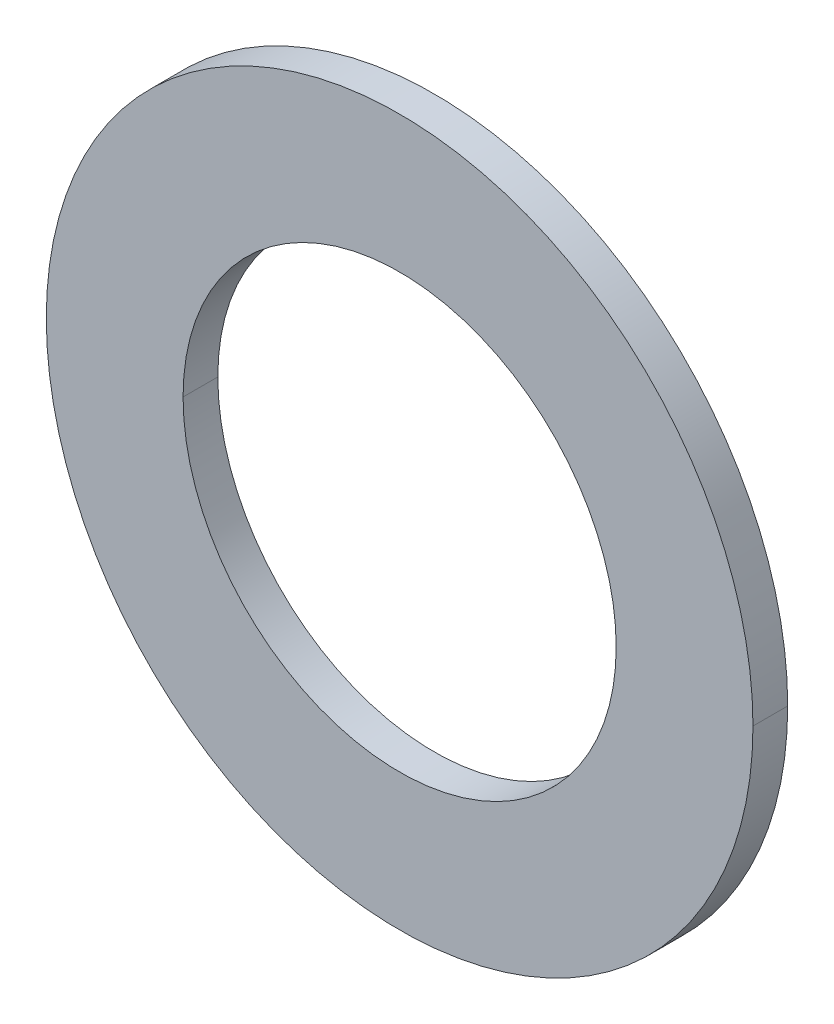
ISO-10303-21;
HEADER;
FILE_DESCRIPTION(('STEP AP214'),'2;1');
FILE_NAME('part.step','',(''),(''),'','','');
FILE_SCHEMA(('AUTOMOTIVE_DESIGN { 1 0 10303 214 1 1 1 1 }'));
ENDSEC;
DATA;
#1=APPLICATION_CONTEXT('core data for automotive mechanical design processes');
#2=APPLICATION_PROTOCOL_DEFINITION('international standard','automotive_design',2000,#1);
#3=PRODUCT_CONTEXT('',#1,'mechanical');
#4=PRODUCT('Part','Part','',(#3));
#5=PRODUCT_RELATED_PRODUCT_CATEGORY('part','',(#4));
#6=PRODUCT_DEFINITION_FORMATION('','',#4);
#7=PRODUCT_DEFINITION_CONTEXT('part definition',#1,'design');
#8=PRODUCT_DEFINITION('design','',#6,#7);
#9=PRODUCT_DEFINITION_SHAPE('','',#8);
#10=(LENGTH_UNIT() NAMED_UNIT(*) SI_UNIT(.MILLI.,.METRE.));
#11=(NAMED_UNIT(*) PLANE_ANGLE_UNIT() SI_UNIT($,.RADIAN.));
#12=(NAMED_UNIT(*) SI_UNIT($,.STERADIAN.) SOLID_ANGLE_UNIT());
#13=UNCERTAINTY_MEASURE_WITH_UNIT(LENGTH_MEASURE(1.E-05),#10,'distance_accuracy_value','');
#14=(GEOMETRIC_REPRESENTATION_CONTEXT(3) GLOBAL_UNCERTAINTY_ASSIGNED_CONTEXT((#13)) GLOBAL_UNIT_ASSIGNED_CONTEXT((#10,
#11,#12)) REPRESENTATION_CONTEXT('',''));
#15=CARTESIAN_POINT('',(0.,0.,0.));
#16=DIRECTION('',(0.,0.,1.));
#17=DIRECTION('',(1.,0.,0.));
#18=AXIS2_PLACEMENT_3D('',#15,#16,#17);
#19=CARTESIAN_POINT('',(0.,0.,1.524));
#20=DIRECTION('',(0.,0.,-1.));
#21=DIRECTION('',(-1.,0.,0.));
#22=AXIS2_PLACEMENT_3D('',#19,#20,#21);
#23=CYLINDRICAL_SURFACE('',#22,9.5);
#24=DIRECTION('',(0.,0.,-1.));
#25=VECTOR('',#24,1.);
#26=CARTESIAN_POINT('',(9.5,0.,1.524));
#27=LINE('',#26,#25);
#28=CARTESIAN_POINT('',(9.5,0.,1.524));
#29=VERTEX_POINT('',#28);
#30=CARTESIAN_POINT('',(9.5,0.,0.));
#31=VERTEX_POINT('',#30);
#32=EDGE_CURVE('E103',#29,#31,#27,.T.);
#33=ORIENTED_EDGE('',*,*,#32,.F.);
#34=CARTESIAN_POINT('',(0.,0.,1.524));
#35=DIRECTION('',(0.,0.,1.));
#36=DIRECTION('',(1.,0.,0.));
#37=AXIS2_PLACEMENT_3D('',#34,#35,#36);
#38=CIRCLE('',#37,9.5);
#39=CARTESIAN_POINT('',(-9.5,0.,1.524));
#40=VERTEX_POINT('',#39);
#41=EDGE_CURVE('E20',#29,#40,#38,.T.);
#42=ORIENTED_EDGE('',*,*,#41,.T.);
#43=DIRECTION('',(0.,0.,-1.));
#44=VECTOR('',#43,1.);
#45=CARTESIAN_POINT('',(-9.5,0.,1.524));
#46=LINE('',#45,#44);
#47=CARTESIAN_POINT('',(-9.5,0.,0.));
#48=VERTEX_POINT('',#47);
#49=EDGE_CURVE('E85',#40,#48,#46,.T.);
#50=ORIENTED_EDGE('',*,*,#49,.T.);
#51=CARTESIAN_POINT('',(0.,0.,0.));
#52=DIRECTION('',(0.,0.,1.));
#53=DIRECTION('',(1.,0.,0.));
#54=AXIS2_PLACEMENT_3D('',#51,#52,#53);
#55=CIRCLE('',#54,9.5);
#56=EDGE_CURVE('E11',#31,#48,#55,.T.);
#57=ORIENTED_EDGE('',*,*,#56,.F.);
#58=EDGE_LOOP('',(#33,#42,#50,#57));
#59=FACE_BOUND('',#58,.T.);
#60=ADVANCED_FACE('F16',(#59),#23,.F.);
#61=CARTESIAN_POINT('',(0.,0.,1.524));
#62=DIRECTION('',(0.,0.,-1.));
#63=DIRECTION('',(-1.,0.,0.));
#64=AXIS2_PLACEMENT_3D('',#61,#62,#63);
#65=CYLINDRICAL_SURFACE('',#64,15.5);
#66=DIRECTION('',(0.,0.,-1.));
#67=VECTOR('',#66,1.);
#68=CARTESIAN_POINT('',(15.5,0.,1.524));
#69=LINE('',#68,#67);
#70=CARTESIAN_POINT('',(15.5,0.,1.524));
#71=VERTEX_POINT('',#70);
#72=CARTESIAN_POINT('',(15.5,0.,0.));
#73=VERTEX_POINT('',#72);
#74=EDGE_CURVE('E74',#71,#73,#69,.T.);
#75=ORIENTED_EDGE('',*,*,#74,.F.);
#76=CARTESIAN_POINT('',(0.,0.,1.524));
#77=DIRECTION('',(0.,0.,1.));
#78=DIRECTION('',(1.,0.,0.));
#79=AXIS2_PLACEMENT_3D('',#76,#77,#78);
#80=CIRCLE('',#79,15.5);
#81=CARTESIAN_POINT('',(-15.5,0.,1.524));
#82=VERTEX_POINT('',#81);
#83=EDGE_CURVE('E62',#82,#71,#80,.T.);
#84=ORIENTED_EDGE('',*,*,#83,.F.);
#85=DIRECTION('',(0.,0.,-1.));
#86=VECTOR('',#85,1.);
#87=CARTESIAN_POINT('',(-15.5,0.,1.524));
#88=LINE('',#87,#86);
#89=CARTESIAN_POINT('',(-15.5,0.,0.));
#90=VERTEX_POINT('',#89);
#91=EDGE_CURVE('E71',#82,#90,#88,.T.);
#92=ORIENTED_EDGE('',*,*,#91,.T.);
#93=CARTESIAN_POINT('',(0.,0.,0.));
#94=DIRECTION('',(0.,0.,1.));
#95=DIRECTION('',(1.,0.,0.));
#96=AXIS2_PLACEMENT_3D('',#93,#94,#95);
#97=CIRCLE('',#96,15.5);
#98=EDGE_CURVE('E27',#90,#73,#97,.T.);
#99=ORIENTED_EDGE('',*,*,#98,.T.);
#100=EDGE_LOOP('',(#75,#84,#92,#99));
#101=FACE_BOUND('',#100,.T.);
#102=ADVANCED_FACE('F70',(#101),#65,.T.);
#103=CARTESIAN_POINT('',(0.,0.,0.));
#104=DIRECTION('',(0.,0.,1.));
#105=DIRECTION('',(1.,0.,0.));
#106=AXIS2_PLACEMENT_3D('',#103,#104,#105);
#107=PLANE('',#106);
#108=CARTESIAN_POINT('',(0.,0.,0.));
#109=DIRECTION('',(0.,0.,1.));
#110=DIRECTION('',(1.,0.,0.));
#111=AXIS2_PLACEMENT_3D('',#108,#109,#110);
#112=CIRCLE('',#111,9.5);
#113=EDGE_CURVE('E93',#48,#31,#112,.T.);
#114=ORIENTED_EDGE('',*,*,#113,.T.);
#115=ORIENTED_EDGE('',*,*,#56,.T.);
#116=EDGE_LOOP('',(#114,#115));
#117=FACE_BOUND('',#116,.T.);
#118=ORIENTED_EDGE('',*,*,#98,.F.);
#119=CARTESIAN_POINT('',(0.,0.,0.));
#120=DIRECTION('',(0.,0.,1.));
#121=DIRECTION('',(1.,0.,0.));
#122=AXIS2_PLACEMENT_3D('',#119,#120,#121);
#123=CIRCLE('',#122,15.5);
#124=EDGE_CURVE('E81',#73,#90,#123,.T.);
#125=ORIENTED_EDGE('',*,*,#124,.F.);
#126=EDGE_LOOP('',(#118,#125));
#127=FACE_BOUND('',#126,.T.);
#128=ADVANCED_FACE('F132',(#117,#127),#107,.F.);
#129=CARTESIAN_POINT('',(0.,0.,1.524));
#130=DIRECTION('',(0.,0.,1.));
#131=DIRECTION('',(1.,0.,0.));
#132=AXIS2_PLACEMENT_3D('',#129,#130,#131);
#133=PLANE('',#132);
#134=CARTESIAN_POINT('',(0.,0.,1.524));
#135=DIRECTION('',(0.,0.,1.));
#136=DIRECTION('',(1.,0.,0.));
#137=AXIS2_PLACEMENT_3D('',#134,#135,#136);
#138=CIRCLE('',#137,9.5);
#139=EDGE_CURVE('E99',#40,#29,#138,.T.);
#140=ORIENTED_EDGE('',*,*,#139,.F.);
#141=ORIENTED_EDGE('',*,*,#41,.F.);
#142=EDGE_LOOP('',(#140,#141));
#143=FACE_BOUND('',#142,.T.);
#144=ORIENTED_EDGE('',*,*,#83,.T.);
#145=CARTESIAN_POINT('',(0.,0.,1.524));
#146=DIRECTION('',(0.,0.,1.));
#147=DIRECTION('',(1.,0.,0.));
#148=AXIS2_PLACEMENT_3D('',#145,#146,#147);
#149=CIRCLE('',#148,15.5);
#150=EDGE_CURVE('E80',#71,#82,#149,.T.);
#151=ORIENTED_EDGE('',*,*,#150,.T.);
#152=EDGE_LOOP('',(#144,#151));
#153=FACE_BOUND('',#152,.T.);
#154=ADVANCED_FACE('F18',(#143,#153),#133,.T.);
#155=CARTESIAN_POINT('',(0.,0.,1.524));
#156=DIRECTION('',(0.,0.,-1.));
#157=DIRECTION('',(-1.,0.,0.));
#158=AXIS2_PLACEMENT_3D('',#155,#156,#157);
#159=CYLINDRICAL_SURFACE('',#158,15.5);
#160=ORIENTED_EDGE('',*,*,#150,.F.);
#161=ORIENTED_EDGE('',*,*,#74,.T.);
#162=ORIENTED_EDGE('',*,*,#124,.T.);
#163=ORIENTED_EDGE('',*,*,#91,.F.);
#164=EDGE_LOOP('',(#160,#161,#162,#163));
#165=FACE_BOUND('',#164,.T.);
#166=ADVANCED_FACE('F79',(#165),#159,.T.);
#167=CARTESIAN_POINT('',(0.,0.,1.524));
#168=DIRECTION('',(0.,0.,-1.));
#169=DIRECTION('',(-1.,0.,0.));
#170=AXIS2_PLACEMENT_3D('',#167,#168,#169);
#171=CYLINDRICAL_SURFACE('',#170,9.5);
#172=ORIENTED_EDGE('',*,*,#139,.T.);
#173=ORIENTED_EDGE('',*,*,#32,.T.);
#174=ORIENTED_EDGE('',*,*,#113,.F.);
#175=ORIENTED_EDGE('',*,*,#49,.F.);
#176=EDGE_LOOP('',(#172,#173,#174,#175));
#177=FACE_BOUND('',#176,.T.);
#178=ADVANCED_FACE('F130',(#177),#171,.F.);
#179=CLOSED_SHELL('',(#60,#102,#128,#154,#166,#178));
#180=MANIFOLD_SOLID_BREP('B1',#179);
#181=ADVANCED_BREP_SHAPE_REPRESENTATION('',(#18,#180),#14);
#182=SHAPE_DEFINITION_REPRESENTATION(#9,#181);
ENDSEC;
END-ISO-10303-21;
